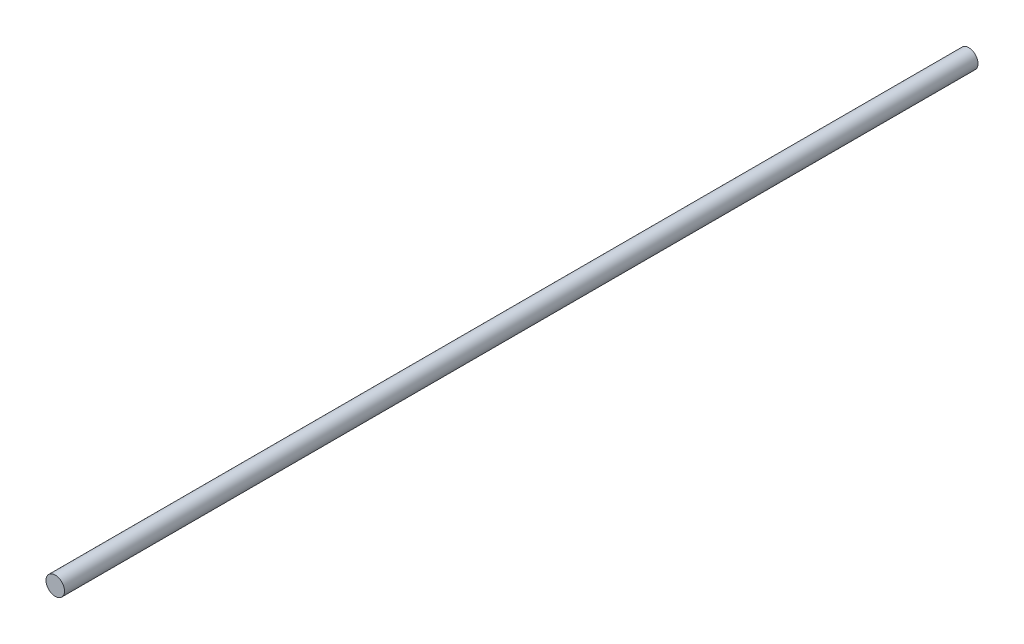
ISO-10303-21;
HEADER;
FILE_DESCRIPTION(('STEP AP214'),'2;1');
FILE_NAME('part.step','',(''),(''),'','','');
FILE_SCHEMA(('AUTOMOTIVE_DESIGN { 1 0 10303 214 1 1 1 1 }'));
ENDSEC;
DATA;
#1=APPLICATION_CONTEXT('core data for automotive mechanical design processes');
#2=APPLICATION_PROTOCOL_DEFINITION('international standard','automotive_design',2000,#1);
#3=PRODUCT_CONTEXT('',#1,'mechanical');
#4=PRODUCT('Part','Part','',(#3));
#5=PRODUCT_RELATED_PRODUCT_CATEGORY('part','',(#4));
#6=PRODUCT_DEFINITION_FORMATION('','',#4);
#7=PRODUCT_DEFINITION_CONTEXT('part definition',#1,'design');
#8=PRODUCT_DEFINITION('design','',#6,#7);
#9=PRODUCT_DEFINITION_SHAPE('','',#8);
#10=(LENGTH_UNIT() NAMED_UNIT(*) SI_UNIT(.MILLI.,.METRE.));
#11=(NAMED_UNIT(*) PLANE_ANGLE_UNIT() SI_UNIT($,.RADIAN.));
#12=(NAMED_UNIT(*) SI_UNIT($,.STERADIAN.) SOLID_ANGLE_UNIT());
#13=UNCERTAINTY_MEASURE_WITH_UNIT(LENGTH_MEASURE(1.E-05),#10,'distance_accuracy_value','');
#14=(GEOMETRIC_REPRESENTATION_CONTEXT(3) GLOBAL_UNCERTAINTY_ASSIGNED_CONTEXT((#13)) GLOBAL_UNIT_ASSIGNED_CONTEXT((#10,
#11,#12)) REPRESENTATION_CONTEXT('',''));
#15=CARTESIAN_POINT('',(0.,0.,0.));
#16=DIRECTION('',(0.,0.,1.));
#17=DIRECTION('',(1.,0.,0.));
#18=AXIS2_PLACEMENT_3D('',#15,#16,#17);
#19=CARTESIAN_POINT('',(0.,0.,395.));
#20=DIRECTION('',(0.,0.,-1.));
#21=DIRECTION('',(-1.,0.,0.));
#22=AXIS2_PLACEMENT_3D('',#19,#20,#21);
#23=CYLINDRICAL_SURFACE('',#22,4.);
#24=CARTESIAN_POINT('',(0.,0.,395.));
#25=DIRECTION('',(0.,0.,1.));
#26=DIRECTION('',(1.,0.,0.));
#27=AXIS2_PLACEMENT_3D('',#24,#25,#26);
#28=CIRCLE('',#27,4.);
#29=CARTESIAN_POINT('',(-4.,0.,395.));
#30=VERTEX_POINT('',#29);
#31=EDGE_CURVE('E10',#30,#30,#28,.T.);
#32=CARTESIAN_POINT('',(0.,0.,0.));
#33=DIRECTION('',(0.,0.,1.));
#34=DIRECTION('',(1.,0.,0.));
#35=AXIS2_PLACEMENT_3D('',#32,#33,#34);
#36=CIRCLE('',#35,4.);
#37=CARTESIAN_POINT('',(-4.,0.,0.));
#38=VERTEX_POINT('',#37);
#39=EDGE_CURVE('E33',#38,#38,#36,.T.);
#40=CARTESIAN_POINT('',(-4.,0.,395.));
#41=CARTESIAN_POINT('',(-4.,0.,390.885416666667));
#42=CARTESIAN_POINT('',(-4.,0.,386.770833333333));
#43=CARTESIAN_POINT('',(-4.,0.,378.541666666667));
#44=CARTESIAN_POINT('',(-4.,0.,374.427083333333));
#45=CARTESIAN_POINT('',(-4.,0.,366.197916666667));
#46=CARTESIAN_POINT('',(-4.,0.,362.083333333333));
#47=CARTESIAN_POINT('',(-4.,0.,353.854166666667));
#48=CARTESIAN_POINT('',(-4.,0.,349.739583333333));
#49=CARTESIAN_POINT('',(-4.,0.,341.510416666667));
#50=CARTESIAN_POINT('',(-4.,0.,337.395833333333));
#51=CARTESIAN_POINT('',(-4.,0.,329.166666666667));
#52=CARTESIAN_POINT('',(-4.,0.,325.052083333333));
#53=CARTESIAN_POINT('',(-4.,0.,316.822916666667));
#54=CARTESIAN_POINT('',(-4.,0.,312.708333333333));
#55=CARTESIAN_POINT('',(-4.,0.,304.479166666667));
#56=CARTESIAN_POINT('',(-4.,0.,300.364583333333));
#57=CARTESIAN_POINT('',(-4.,0.,292.135416666667));
#58=CARTESIAN_POINT('',(-4.,0.,288.020833333333));
#59=CARTESIAN_POINT('',(-4.,0.,279.791666666667));
#60=CARTESIAN_POINT('',(-4.,0.,275.677083333333));
#61=CARTESIAN_POINT('',(-4.,0.,267.447916666667));
#62=CARTESIAN_POINT('',(-4.,0.,263.333333333333));
#63=CARTESIAN_POINT('',(-4.,0.,255.104166666667));
#64=CARTESIAN_POINT('',(-4.,0.,250.989583333333));
#65=CARTESIAN_POINT('',(-4.,0.,242.760416666667));
#66=CARTESIAN_POINT('',(-4.,0.,238.645833333333));
#67=CARTESIAN_POINT('',(-4.,0.,230.416666666667));
#68=CARTESIAN_POINT('',(-4.,0.,226.302083333333));
#69=CARTESIAN_POINT('',(-4.,0.,218.072916666667));
#70=CARTESIAN_POINT('',(-4.,0.,213.958333333333));
#71=CARTESIAN_POINT('',(-4.,0.,205.729166666667));
#72=CARTESIAN_POINT('',(-4.,0.,201.614583333333));
#73=CARTESIAN_POINT('',(-4.,0.,193.385416666667));
#74=CARTESIAN_POINT('',(-4.,0.,189.270833333333));
#75=CARTESIAN_POINT('',(-4.,0.,181.041666666667));
#76=CARTESIAN_POINT('',(-4.,0.,176.927083333333));
#77=CARTESIAN_POINT('',(-4.,0.,168.697916666667));
#78=CARTESIAN_POINT('',(-4.,0.,164.583333333333));
#79=CARTESIAN_POINT('',(-4.,0.,156.354166666667));
#80=CARTESIAN_POINT('',(-4.,0.,152.239583333333));
#81=CARTESIAN_POINT('',(-4.,0.,144.010416666667));
#82=CARTESIAN_POINT('',(-4.,0.,139.895833333333));
#83=CARTESIAN_POINT('',(-4.,0.,131.666666666667));
#84=CARTESIAN_POINT('',(-4.,0.,127.552083333333));
#85=CARTESIAN_POINT('',(-4.,0.,119.322916666667));
#86=CARTESIAN_POINT('',(-4.,0.,115.208333333333));
#87=CARTESIAN_POINT('',(-4.,0.,106.979166666667));
#88=CARTESIAN_POINT('',(-4.,0.,102.864583333333));
#89=CARTESIAN_POINT('',(-4.,0.,94.6354166666666));
#90=CARTESIAN_POINT('',(-4.,0.,90.5208333333333));
#91=CARTESIAN_POINT('',(-4.,0.,82.2916666666666));
#92=CARTESIAN_POINT('',(-4.,0.,78.1770833333333));
#93=CARTESIAN_POINT('',(-4.,0.,69.9479166666667));
#94=CARTESIAN_POINT('',(-4.,0.,65.8333333333333));
#95=CARTESIAN_POINT('',(-4.,0.,57.6041666666666));
#96=CARTESIAN_POINT('',(-4.,0.,53.4895833333333));
#97=CARTESIAN_POINT('',(-4.,0.,45.2604166666666));
#98=CARTESIAN_POINT('',(-4.,0.,41.1458333333333));
#99=CARTESIAN_POINT('',(-4.,0.,32.9166666666666));
#100=CARTESIAN_POINT('',(-4.,0.,28.8020833333333));
#101=CARTESIAN_POINT('',(-4.,0.,20.5729166666666));
#102=CARTESIAN_POINT('',(-4.,0.,16.4583333333333));
#103=CARTESIAN_POINT('',(-4.,0.,8.2291666666666));
#104=CARTESIAN_POINT('',(-4.,0.,4.11458333333327));
#105=CARTESIAN_POINT('',(-4.,0.,0.));
#106=B_SPLINE_CURVE_WITH_KNOTS('',3,(#40,#41,#42,#43,#44,#45,#46,#47,#48,#49,#50,#51,#52,#53,
#54,#55,#56,#57,#58,#59,#60,#61,#62,#63,#64,#65,#66,#67,#68,#69,#70,#71,#72,#73,#74,#75,#76,#77,
#78,#79,#80,#81,#82,#83,#84,#85,#86,#87,#88,#89,#90,#91,#92,#93,#94,#95,#96,#97,#98,#99,#100,
#101,#102,#103,#104,#105),.UNSPECIFIED.,.F.,.F.,(4,2,2,2,2,2,2,2,2,2,2,2,2,2,2,2,2,2,2,2,2,2,2,
2,2,2,2,2,2,2,2,2,4),(0.,12.34375,24.6875,37.03125,49.3750000000001,61.71875,74.0625,86.40625,
98.7500000000001,111.09375,123.4375,135.78125,148.125,160.46875,172.8125,185.15625,197.5,
209.84375,222.1875,234.53125,246.875,259.21875,271.5625,283.90625,296.25,308.59375,320.9375,
333.28125,345.625,357.96875,370.3125,382.65625,395.),.UNSPECIFIED.);
#107=EDGE_CURVE('BSEAM30',#30,#38,#106,.T.);
#108=ORIENTED_EDGE('',*,*,#31,.F.);
#109=ORIENTED_EDGE('',*,*,#39,.T.);
#110=ORIENTED_EDGE('',*,*,#107,.T.);
#111=ORIENTED_EDGE('',*,*,#107,.F.);
#112=EDGE_LOOP('',(#108,#110,#109,#111));
#113=FACE_BOUND('',#112,.T.);
#114=ADVANCED_FACE('F30',(#113),#23,.T.);
#115=CARTESIAN_POINT('',(0.,0.,395.));
#116=DIRECTION('',(0.,0.,1.));
#117=DIRECTION('',(1.,0.,0.));
#118=AXIS2_PLACEMENT_3D('',#115,#116,#117);
#119=PLANE('',#118);
#120=ORIENTED_EDGE('',*,*,#31,.T.);
#121=EDGE_LOOP('',(#120));
#122=FACE_BOUND('',#121,.T.);
#123=ADVANCED_FACE('F45',(#122),#119,.T.);
#124=CARTESIAN_POINT('',(0.,0.,0.));
#125=DIRECTION('',(0.,0.,1.));
#126=DIRECTION('',(1.,0.,0.));
#127=AXIS2_PLACEMENT_3D('',#124,#125,#126);
#128=PLANE('',#127);
#129=ORIENTED_EDGE('',*,*,#39,.F.);
#130=EDGE_LOOP('',(#129));
#131=FACE_BOUND('',#130,.T.);
#132=ADVANCED_FACE('F43',(#131),#128,.F.);
#133=CLOSED_SHELL('',(#114,#123,#132));
#134=MANIFOLD_SOLID_BREP('B2',#133);
#135=ADVANCED_BREP_SHAPE_REPRESENTATION('',(#18,#134),#14);
#136=SHAPE_DEFINITION_REPRESENTATION(#9,#135);
ENDSEC;
END-ISO-10303-21;
